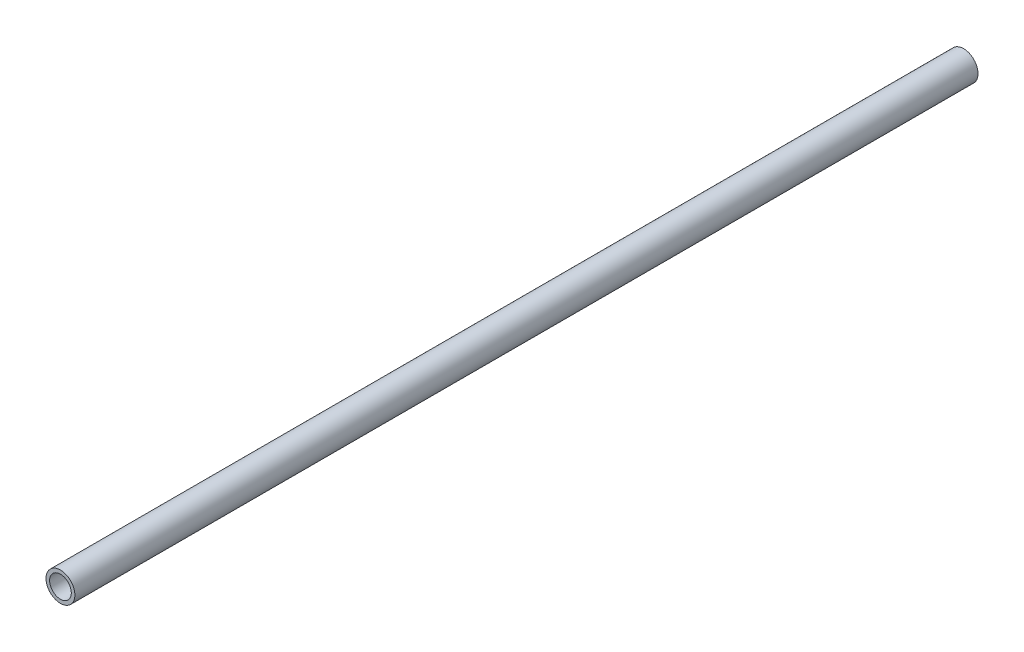
ISO-10303-21;
HEADER;
FILE_DESCRIPTION(('STEP AP214'),'2;1');
FILE_NAME('part.step','',(''),(''),'','','');
FILE_SCHEMA(('AUTOMOTIVE_DESIGN { 1 0 10303 214 1 1 1 1 }'));
ENDSEC;
DATA;
#1=APPLICATION_CONTEXT('core data for automotive mechanical design processes');
#2=APPLICATION_PROTOCOL_DEFINITION('international standard','automotive_design',2000,#1);
#3=PRODUCT_CONTEXT('',#1,'mechanical');
#4=PRODUCT('Part','Part','',(#3));
#5=PRODUCT_RELATED_PRODUCT_CATEGORY('part','',(#4));
#6=PRODUCT_DEFINITION_FORMATION('','',#4);
#7=PRODUCT_DEFINITION_CONTEXT('part definition',#1,'design');
#8=PRODUCT_DEFINITION('design','',#6,#7);
#9=PRODUCT_DEFINITION_SHAPE('','',#8);
#10=(LENGTH_UNIT() NAMED_UNIT(*) SI_UNIT(.MILLI.,.METRE.));
#11=(NAMED_UNIT(*) PLANE_ANGLE_UNIT() SI_UNIT($,.RADIAN.));
#12=(NAMED_UNIT(*) SI_UNIT($,.STERADIAN.) SOLID_ANGLE_UNIT());
#13=UNCERTAINTY_MEASURE_WITH_UNIT(LENGTH_MEASURE(1.E-05),#10,'distance_accuracy_value','');
#14=(GEOMETRIC_REPRESENTATION_CONTEXT(3) GLOBAL_UNCERTAINTY_ASSIGNED_CONTEXT((#13)) GLOBAL_UNIT_ASSIGNED_CONTEXT((#10,
#11,#12)) REPRESENTATION_CONTEXT('',''));
#15=CARTESIAN_POINT('',(0.,0.,0.));
#16=DIRECTION('',(0.,0.,1.));
#17=DIRECTION('',(1.,0.,0.));
#18=AXIS2_PLACEMENT_3D('',#15,#16,#17);
#19=CARTESIAN_POINT('',(0.,0.,793.75));
#20=DIRECTION('',(0.,0.,-1.));
#21=DIRECTION('',(-1.,0.,0.));
#22=AXIS2_PLACEMENT_3D('',#19,#20,#21);
#23=CYLINDRICAL_SURFACE('',#22,12.7);
#24=CARTESIAN_POINT('',(0.,0.,793.75));
#25=DIRECTION('',(0.,0.,1.));
#26=DIRECTION('',(1.,0.,0.));
#27=AXIS2_PLACEMENT_3D('',#24,#25,#26);
#28=CIRCLE('',#27,12.7);
#29=CARTESIAN_POINT('',(-12.7,0.,793.75));
#30=VERTEX_POINT('',#29);
#31=EDGE_CURVE('E10',#30,#30,#28,.T.);
#32=CARTESIAN_POINT('',(0.,0.,0.));
#33=DIRECTION('',(0.,0.,1.));
#34=DIRECTION('',(1.,0.,0.));
#35=AXIS2_PLACEMENT_3D('',#32,#33,#34);
#36=CIRCLE('',#35,12.7);
#37=CARTESIAN_POINT('',(-12.7,0.,-1.11022302462516E-13));
#38=VERTEX_POINT('',#37);
#39=EDGE_CURVE('E38',#38,#38,#36,.T.);
#40=CARTESIAN_POINT('',(-12.7,0.,793.75));
#41=CARTESIAN_POINT('',(-12.7,0.,785.481770833333));
#42=CARTESIAN_POINT('',(-12.7,0.,777.213541666667));
#43=CARTESIAN_POINT('',(-12.7,0.,760.677083333333));
#44=CARTESIAN_POINT('',(-12.7,0.,752.408854166667));
#45=CARTESIAN_POINT('',(-12.7,0.,735.872395833333));
#46=CARTESIAN_POINT('',(-12.7,0.,727.604166666667));
#47=CARTESIAN_POINT('',(-12.7,0.,711.067708333333));
#48=CARTESIAN_POINT('',(-12.7,0.,702.799479166667));
#49=CARTESIAN_POINT('',(-12.7,0.,686.263020833333));
#50=CARTESIAN_POINT('',(-12.7,0.,677.994791666667));
#51=CARTESIAN_POINT('',(-12.7,0.,661.458333333333));
#52=CARTESIAN_POINT('',(-12.7,0.,653.190104166667));
#53=CARTESIAN_POINT('',(-12.7,0.,636.653645833333));
#54=CARTESIAN_POINT('',(-12.7,0.,628.385416666667));
#55=CARTESIAN_POINT('',(-12.7,0.,611.848958333333));
#56=CARTESIAN_POINT('',(-12.7,0.,603.580729166667));
#57=CARTESIAN_POINT('',(-12.7,0.,587.044270833333));
#58=CARTESIAN_POINT('',(-12.7,0.,578.776041666667));
#59=CARTESIAN_POINT('',(-12.7,0.,562.239583333333));
#60=CARTESIAN_POINT('',(-12.7,0.,553.971354166667));
#61=CARTESIAN_POINT('',(-12.7,0.,537.434895833333));
#62=CARTESIAN_POINT('',(-12.7,0.,529.166666666667));
#63=CARTESIAN_POINT('',(-12.7,0.,512.630208333333));
#64=CARTESIAN_POINT('',(-12.7,0.,504.361979166667));
#65=CARTESIAN_POINT('',(-12.7,0.,487.825520833333));
#66=CARTESIAN_POINT('',(-12.7,0.,479.557291666667));
#67=CARTESIAN_POINT('',(-12.7,0.,463.020833333333));
#68=CARTESIAN_POINT('',(-12.7,0.,454.752604166667));
#69=CARTESIAN_POINT('',(-12.7,0.,438.216145833333));
#70=CARTESIAN_POINT('',(-12.7,0.,429.947916666667));
#71=CARTESIAN_POINT('',(-12.7,0.,413.411458333333));
#72=CARTESIAN_POINT('',(-12.7,0.,405.143229166667));
#73=CARTESIAN_POINT('',(-12.7,0.,388.606770833333));
#74=CARTESIAN_POINT('',(-12.7,0.,380.338541666667));
#75=CARTESIAN_POINT('',(-12.7,0.,363.802083333333));
#76=CARTESIAN_POINT('',(-12.7,0.,355.533854166667));
#77=CARTESIAN_POINT('',(-12.7,0.,338.997395833333));
#78=CARTESIAN_POINT('',(-12.7,0.,330.729166666667));
#79=CARTESIAN_POINT('',(-12.7,0.,314.192708333333));
#80=CARTESIAN_POINT('',(-12.7,0.,305.924479166666));
#81=CARTESIAN_POINT('',(-12.7,0.,289.388020833333));
#82=CARTESIAN_POINT('',(-12.7,0.,281.119791666667));
#83=CARTESIAN_POINT('',(-12.7,0.,264.583333333333));
#84=CARTESIAN_POINT('',(-12.7,0.,256.315104166667));
#85=CARTESIAN_POINT('',(-12.7,0.,239.778645833333));
#86=CARTESIAN_POINT('',(-12.7,0.,231.510416666667));
#87=CARTESIAN_POINT('',(-12.7,0.,214.973958333333));
#88=CARTESIAN_POINT('',(-12.7,0.,206.705729166667));
#89=CARTESIAN_POINT('',(-12.7,0.,190.169270833333));
#90=CARTESIAN_POINT('',(-12.7,0.,181.901041666667));
#91=CARTESIAN_POINT('',(-12.7,0.,165.364583333333));
#92=CARTESIAN_POINT('',(-12.7,0.,157.096354166667));
#93=CARTESIAN_POINT('',(-12.7,0.,140.559895833333));
#94=CARTESIAN_POINT('',(-12.7,0.,132.291666666667));
#95=CARTESIAN_POINT('',(-12.7,0.,115.755208333333));
#96=CARTESIAN_POINT('',(-12.7,0.,107.486979166667));
#97=CARTESIAN_POINT('',(-12.7,0.,90.9505208333333));
#98=CARTESIAN_POINT('',(-12.7,0.,82.6822916666666));
#99=CARTESIAN_POINT('',(-12.7,0.,66.1458333333332));
#100=CARTESIAN_POINT('',(-12.7,0.,57.8776041666665));
#101=CARTESIAN_POINT('',(-12.7,0.,41.3411458333332));
#102=CARTESIAN_POINT('',(-12.7,0.,33.0729166666665));
#103=CARTESIAN_POINT('',(-12.7,0.,16.5364583333332));
#104=CARTESIAN_POINT('',(-12.7,0.,8.26822916666655));
#105=CARTESIAN_POINT('',(-12.7,0.,-1.11022302462516E-13));
#106=B_SPLINE_CURVE_WITH_KNOTS('',3,(#40,#41,#42,#43,#44,#45,#46,#47,#48,#49,#50,#51,#52,#53,
#54,#55,#56,#57,#58,#59,#60,#61,#62,#63,#64,#65,#66,#67,#68,#69,#70,#71,#72,#73,#74,#75,#76,#77,
#78,#79,#80,#81,#82,#83,#84,#85,#86,#87,#88,#89,#90,#91,#92,#93,#94,#95,#96,#97,#98,#99,#100,
#101,#102,#103,#104,#105),.UNSPECIFIED.,.F.,.F.,(4,2,2,2,2,2,2,2,2,2,2,2,2,2,2,2,2,2,2,2,2,2,2,
2,2,2,2,2,2,2,2,2,4),(0.,24.8046875000001,49.6093750000001,74.4140625,99.21875,124.0234375,
148.828125,173.6328125,198.4375,223.2421875,248.046875,272.8515625,297.65625,322.4609375,
347.265625,372.0703125,396.875,421.6796875,446.484375,471.2890625,496.09375,520.8984375,
545.703125,570.5078125,595.3125,620.1171875,644.921875,669.7265625,694.53125,719.3359375,
744.140625,768.9453125,793.75),.UNSPECIFIED.);
#107=EDGE_CURVE('BSEAM35',#30,#38,#106,.T.);
#108=ORIENTED_EDGE('',*,*,#31,.F.);
#109=ORIENTED_EDGE('',*,*,#39,.T.);
#110=ORIENTED_EDGE('',*,*,#107,.T.);
#111=ORIENTED_EDGE('',*,*,#107,.F.);
#112=EDGE_LOOP('',(#108,#110,#109,#111));
#113=FACE_BOUND('',#112,.T.);
#114=ADVANCED_FACE('F35',(#113),#23,.T.);
#115=CARTESIAN_POINT('',(0.,0.,793.75));
#116=DIRECTION('',(0.,0.,1.));
#117=DIRECTION('',(1.,0.,0.));
#118=AXIS2_PLACEMENT_3D('',#115,#116,#117);
#119=PLANE('',#118);
#120=CARTESIAN_POINT('',(0.,0.,793.75));
#121=DIRECTION('',(0.,0.,1.));
#122=DIRECTION('',(1.,0.,0.));
#123=AXIS2_PLACEMENT_3D('',#120,#121,#122);
#124=CIRCLE('',#123,9.525);
#125=CARTESIAN_POINT('',(-9.525,0.,793.75));
#126=VERTEX_POINT('',#125);
#127=EDGE_CURVE('E45',#126,#126,#124,.T.);
#128=ORIENTED_EDGE('',*,*,#127,.F.);
#129=EDGE_LOOP('',(#128));
#130=FACE_BOUND('',#129,.T.);
#131=ORIENTED_EDGE('',*,*,#31,.T.);
#132=EDGE_LOOP('',(#131));
#133=FACE_BOUND('',#132,.T.);
#134=ADVANCED_FACE('F56',(#130,#133),#119,.T.);
#135=CARTESIAN_POINT('',(0.,0.,0.));
#136=DIRECTION('',(0.,0.,1.));
#137=DIRECTION('',(1.,0.,0.));
#138=AXIS2_PLACEMENT_3D('',#135,#136,#137);
#139=PLANE('',#138);
#140=CARTESIAN_POINT('',(0.,0.,0.));
#141=DIRECTION('',(0.,0.,1.));
#142=DIRECTION('',(1.,0.,0.));
#143=AXIS2_PLACEMENT_3D('',#140,#141,#142);
#144=CIRCLE('',#143,9.525);
#145=CARTESIAN_POINT('',(-9.525,0.,-1.11022302462516E-13));
#146=VERTEX_POINT('',#145);
#147=EDGE_CURVE('E47',#146,#146,#144,.T.);
#148=ORIENTED_EDGE('',*,*,#147,.T.);
#149=EDGE_LOOP('',(#148));
#150=FACE_BOUND('',#149,.T.);
#151=ORIENTED_EDGE('',*,*,#39,.F.);
#152=EDGE_LOOP('',(#151));
#153=FACE_BOUND('',#152,.T.);
#154=ADVANCED_FACE('F58',(#150,#153),#139,.F.);
#155=CARTESIAN_POINT('',(0.,0.,793.75));
#156=DIRECTION('',(0.,0.,-1.));
#157=DIRECTION('',(-1.,0.,0.));
#158=AXIS2_PLACEMENT_3D('',#155,#156,#157);
#159=CYLINDRICAL_SURFACE('',#158,9.525);
#160=CARTESIAN_POINT('',(-9.525,0.,793.75));
#161=CARTESIAN_POINT('',(-9.525,0.,785.481770833333));
#162=CARTESIAN_POINT('',(-9.525,0.,777.213541666667));
#163=CARTESIAN_POINT('',(-9.525,0.,760.677083333333));
#164=CARTESIAN_POINT('',(-9.525,0.,752.408854166667));
#165=CARTESIAN_POINT('',(-9.525,0.,735.872395833333));
#166=CARTESIAN_POINT('',(-9.525,0.,727.604166666667));
#167=CARTESIAN_POINT('',(-9.525,0.,711.067708333333));
#168=CARTESIAN_POINT('',(-9.525,0.,702.799479166667));
#169=CARTESIAN_POINT('',(-9.525,0.,686.263020833333));
#170=CARTESIAN_POINT('',(-9.525,0.,677.994791666667));
#171=CARTESIAN_POINT('',(-9.525,0.,661.458333333333));
#172=CARTESIAN_POINT('',(-9.525,0.,653.190104166667));
#173=CARTESIAN_POINT('',(-9.525,0.,636.653645833333));
#174=CARTESIAN_POINT('',(-9.525,0.,628.385416666667));
#175=CARTESIAN_POINT('',(-9.525,0.,611.848958333333));
#176=CARTESIAN_POINT('',(-9.525,0.,603.580729166667));
#177=CARTESIAN_POINT('',(-9.525,0.,587.044270833333));
#178=CARTESIAN_POINT('',(-9.525,0.,578.776041666667));
#179=CARTESIAN_POINT('',(-9.525,0.,562.239583333333));
#180=CARTESIAN_POINT('',(-9.525,0.,553.971354166667));
#181=CARTESIAN_POINT('',(-9.525,0.,537.434895833333));
#182=CARTESIAN_POINT('',(-9.525,0.,529.166666666667));
#183=CARTESIAN_POINT('',(-9.525,0.,512.630208333333));
#184=CARTESIAN_POINT('',(-9.525,0.,504.361979166667));
#185=CARTESIAN_POINT('',(-9.525,0.,487.825520833333));
#186=CARTESIAN_POINT('',(-9.525,0.,479.557291666667));
#187=CARTESIAN_POINT('',(-9.525,0.,463.020833333333));
#188=CARTESIAN_POINT('',(-9.525,0.,454.752604166667));
#189=CARTESIAN_POINT('',(-9.525,0.,438.216145833333));
#190=CARTESIAN_POINT('',(-9.525,0.,429.947916666667));
#191=CARTESIAN_POINT('',(-9.525,0.,413.411458333333));
#192=CARTESIAN_POINT('',(-9.525,0.,405.143229166667));
#193=CARTESIAN_POINT('',(-9.525,0.,388.606770833333));
#194=CARTESIAN_POINT('',(-9.525,0.,380.338541666667));
#195=CARTESIAN_POINT('',(-9.525,0.,363.802083333333));
#196=CARTESIAN_POINT('',(-9.525,0.,355.533854166667));
#197=CARTESIAN_POINT('',(-9.525,0.,338.997395833333));
#198=CARTESIAN_POINT('',(-9.525,0.,330.729166666667));
#199=CARTESIAN_POINT('',(-9.525,0.,314.192708333333));
#200=CARTESIAN_POINT('',(-9.525,0.,305.924479166666));
#201=CARTESIAN_POINT('',(-9.525,0.,289.388020833333));
#202=CARTESIAN_POINT('',(-9.525,0.,281.119791666667));
#203=CARTESIAN_POINT('',(-9.525,0.,264.583333333333));
#204=CARTESIAN_POINT('',(-9.525,0.,256.315104166667));
#205=CARTESIAN_POINT('',(-9.525,0.,239.778645833333));
#206=CARTESIAN_POINT('',(-9.525,0.,231.510416666667));
#207=CARTESIAN_POINT('',(-9.525,0.,214.973958333333));
#208=CARTESIAN_POINT('',(-9.525,0.,206.705729166667));
#209=CARTESIAN_POINT('',(-9.525,0.,190.169270833333));
#210=CARTESIAN_POINT('',(-9.525,0.,181.901041666667));
#211=CARTESIAN_POINT('',(-9.525,0.,165.364583333333));
#212=CARTESIAN_POINT('',(-9.525,0.,157.096354166667));
#213=CARTESIAN_POINT('',(-9.525,0.,140.559895833333));
#214=CARTESIAN_POINT('',(-9.525,0.,132.291666666667));
#215=CARTESIAN_POINT('',(-9.525,0.,115.755208333333));
#216=CARTESIAN_POINT('',(-9.525,0.,107.486979166667));
#217=CARTESIAN_POINT('',(-9.525,0.,90.9505208333333));
#218=CARTESIAN_POINT('',(-9.525,0.,82.6822916666666));
#219=CARTESIAN_POINT('',(-9.525,0.,66.1458333333332));
#220=CARTESIAN_POINT('',(-9.525,0.,57.8776041666665));
#221=CARTESIAN_POINT('',(-9.525,0.,41.3411458333332));
#222=CARTESIAN_POINT('',(-9.525,0.,33.0729166666665));
#223=CARTESIAN_POINT('',(-9.525,0.,16.5364583333332));
#224=CARTESIAN_POINT('',(-9.525,0.,8.26822916666655));
#225=CARTESIAN_POINT('',(-9.525,0.,-1.11022302462516E-13));
#226=B_SPLINE_CURVE_WITH_KNOTS('',3,(#160,#161,#162,#163,#164,#165,#166,#167,#168,#169,#170,
#171,#172,#173,#174,#175,#176,#177,#178,#179,#180,#181,#182,#183,#184,#185,#186,#187,#188,#189,
#190,#191,#192,#193,#194,#195,#196,#197,#198,#199,#200,#201,#202,#203,#204,#205,#206,#207,#208,
#209,#210,#211,#212,#213,#214,#215,#216,#217,#218,#219,#220,#221,#222,#223,#224,#225),
.UNSPECIFIED.,.F.,.F.,(4,2,2,2,2,2,2,2,2,2,2,2,2,2,2,2,2,2,2,2,2,2,2,2,2,2,2,2,2,2,2,2,4),(0.,
24.8046875000001,49.6093750000001,74.4140625,99.21875,124.0234375,148.828125,173.6328125,
198.4375,223.2421875,248.046875,272.8515625,297.65625,322.4609375,347.265625,372.0703125,
396.875,421.6796875,446.484375,471.2890625,496.09375,520.8984375,545.703125,570.5078125,
595.3125,620.1171875,644.921875,669.7265625,694.53125,719.3359375,744.140625,768.9453125,
793.75),.UNSPECIFIED.);
#227=EDGE_CURVE('BSEAM53',#126,#146,#226,.T.);
#228=ORIENTED_EDGE('',*,*,#127,.T.);
#229=ORIENTED_EDGE('',*,*,#147,.F.);
#230=ORIENTED_EDGE('',*,*,#227,.T.);
#231=ORIENTED_EDGE('',*,*,#227,.F.);
#232=EDGE_LOOP('',(#228,#230,#229,#231));
#233=FACE_BOUND('',#232,.T.);
#234=ADVANCED_FACE('F53',(#233),#159,.F.);
#235=CLOSED_SHELL('',(#114,#134,#154,#234));
#236=MANIFOLD_SOLID_BREP('B2',#235);
#237=ADVANCED_BREP_SHAPE_REPRESENTATION('',(#18,#236),#14);
#238=SHAPE_DEFINITION_REPRESENTATION(#9,#237);
ENDSEC;
END-ISO-10303-21;
